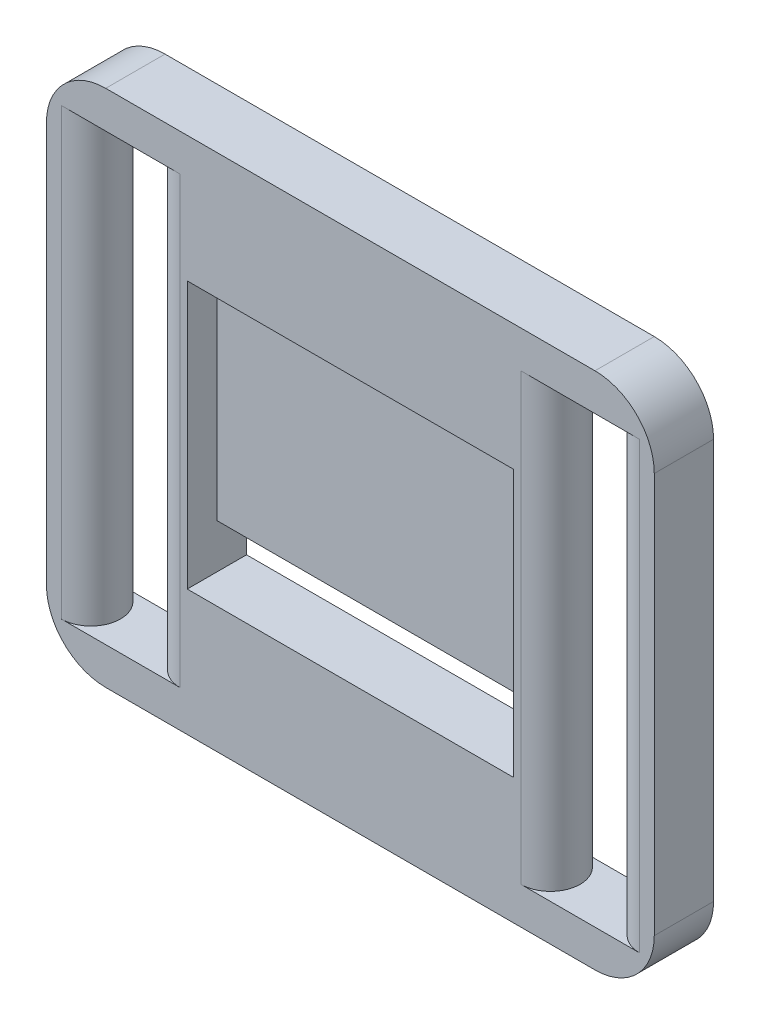
ISO-10303-21;
HEADER;
FILE_DESCRIPTION(('STEP AP214'),'2;1');
FILE_NAME('part.step','',(''),(''),'','','');
FILE_SCHEMA(('AUTOMOTIVE_DESIGN { 1 0 10303 214 1 1 1 1 }'));
ENDSEC;
DATA;
#1=APPLICATION_CONTEXT('core data for automotive mechanical design processes');
#2=APPLICATION_PROTOCOL_DEFINITION('international standard','automotive_design',2000,#1);
#3=PRODUCT_CONTEXT('',#1,'mechanical');
#4=PRODUCT('Part','Part','',(#3));
#5=PRODUCT_RELATED_PRODUCT_CATEGORY('part','',(#4));
#6=PRODUCT_DEFINITION_FORMATION('','',#4);
#7=PRODUCT_DEFINITION_CONTEXT('part definition',#1,'design');
#8=PRODUCT_DEFINITION('design','',#6,#7);
#9=PRODUCT_DEFINITION_SHAPE('','',#8);
#10=(LENGTH_UNIT() NAMED_UNIT(*) SI_UNIT(.MILLI.,.METRE.));
#11=(NAMED_UNIT(*) PLANE_ANGLE_UNIT() SI_UNIT($,.RADIAN.));
#12=(NAMED_UNIT(*) SI_UNIT($,.STERADIAN.) SOLID_ANGLE_UNIT());
#13=UNCERTAINTY_MEASURE_WITH_UNIT(LENGTH_MEASURE(1.E-05),#10,'distance_accuracy_value','');
#14=(GEOMETRIC_REPRESENTATION_CONTEXT(3) GLOBAL_UNCERTAINTY_ASSIGNED_CONTEXT((#13)) GLOBAL_UNIT_ASSIGNED_CONTEXT((#10,
#11,#12)) REPRESENTATION_CONTEXT('',''));
#15=CARTESIAN_POINT('',(0.,0.,0.));
#16=DIRECTION('',(0.,0.,1.));
#17=DIRECTION('',(1.,0.,0.));
#18=AXIS2_PLACEMENT_3D('',#15,#16,#17);
#19=CARTESIAN_POINT('',(9.00000000000002,35.,2.));
#20=DIRECTION('',(0.,1.,0.));
#21=DIRECTION('',(-1.,0.,0.));
#22=AXIS2_PLACEMENT_3D('',#19,#20,#21);
#23=CYLINDRICAL_SURFACE('',#22,2.);
#24=DIRECTION('',(0.,1.,0.));
#25=VECTOR('',#24,1.);
#26=CARTESIAN_POINT('',(9.00000000000002,0.,4.));
#27=LINE('',#26,#25);
#28=CARTESIAN_POINT('',(9.00000000000002,32.5,4.));
#29=VERTEX_POINT('',#28);
#30=CARTESIAN_POINT('',(9.00000000000002,2.50000000000004,4.));
#31=VERTEX_POINT('',#30);
#32=EDGE_CURVE('E347',#29,#31,#27,.F.);
#33=ORIENTED_EDGE('',*,*,#32,.F.);
#34=CARTESIAN_POINT('',(9.00000000000002,32.5,2.));
#35=DIRECTION('',(0.,1.,0.));
#36=DIRECTION('',(0.,0.,1.));
#37=AXIS2_PLACEMENT_3D('',#34,#35,#36);
#38=CIRCLE('',#37,2.);
#39=CARTESIAN_POINT('',(9.00000000000002,32.5,0.));
#40=VERTEX_POINT('',#39);
#41=EDGE_CURVE('E11',#40,#29,#38,.T.);
#42=ORIENTED_EDGE('',*,*,#41,.F.);
#43=DIRECTION('',(0.,-1.,0.));
#44=VECTOR('',#43,1.);
#45=CARTESIAN_POINT('',(9.00000000000002,35.,0.));
#46=LINE('',#45,#44);
#47=CARTESIAN_POINT('',(9.00000000000002,2.50000000000004,0.));
#48=VERTEX_POINT('',#47);
#49=EDGE_CURVE('E350',#48,#40,#46,.F.);
#50=ORIENTED_EDGE('',*,*,#49,.F.);
#51=CARTESIAN_POINT('',(9.00000000000002,2.50000000000004,2.));
#52=DIRECTION('',(0.,-1.,0.));
#53=DIRECTION('',(0.,0.,-1.));
#54=AXIS2_PLACEMENT_3D('',#51,#52,#53);
#55=CIRCLE('',#54,2.);
#56=EDGE_CURVE('E43',#31,#48,#55,.T.);
#57=ORIENTED_EDGE('',*,*,#56,.F.);
#58=EDGE_LOOP('',(#33,#42,#50,#57));
#59=FACE_BOUND('',#58,.T.);
#60=ADVANCED_FACE('F35',(#59),#23,.T.);
#61=CARTESIAN_POINT('',(32.,0.,2.));
#62=DIRECTION('',(0.,-1.,0.));
#63=DIRECTION('',(0.,0.,-1.));
#64=AXIS2_PLACEMENT_3D('',#61,#62,#63);
#65=CYLINDRICAL_SURFACE('',#64,2.);
#66=DIRECTION('',(0.,-1.,0.));
#67=VECTOR('',#66,1.);
#68=CARTESIAN_POINT('',(32.,0.,4.));
#69=LINE('',#68,#67);
#70=CARTESIAN_POINT('',(32.,2.50000000000003,4.));
#71=VERTEX_POINT('',#70);
#72=CARTESIAN_POINT('',(32.,32.5,4.));
#73=VERTEX_POINT('',#72);
#74=EDGE_CURVE('E335',#71,#73,#69,.F.);
#75=ORIENTED_EDGE('',*,*,#74,.F.);
#76=CARTESIAN_POINT('',(32.,2.50000000000003,2.));
#77=DIRECTION('',(0.,-1.,0.));
#78=DIRECTION('',(1.,0.,0.));
#79=AXIS2_PLACEMENT_3D('',#76,#77,#78);
#80=CIRCLE('',#79,2.);
#81=CARTESIAN_POINT('',(32.,2.50000000000003,0.));
#82=VERTEX_POINT('',#81);
#83=EDGE_CURVE('E344',#82,#71,#80,.T.);
#84=ORIENTED_EDGE('',*,*,#83,.F.);
#85=DIRECTION('',(0.,1.,0.));
#86=VECTOR('',#85,1.);
#87=CARTESIAN_POINT('',(32.,0.,0.));
#88=LINE('',#87,#86);
#89=CARTESIAN_POINT('',(32.,32.5,0.));
#90=VERTEX_POINT('',#89);
#91=EDGE_CURVE('E338',#90,#82,#88,.F.);
#92=ORIENTED_EDGE('',*,*,#91,.F.);
#93=CARTESIAN_POINT('',(32.,32.5,2.));
#94=DIRECTION('',(0.,1.,0.));
#95=DIRECTION('',(-1.,0.,0.));
#96=AXIS2_PLACEMENT_3D('',#93,#94,#95);
#97=CIRCLE('',#96,2.);
#98=EDGE_CURVE('E341',#73,#90,#97,.T.);
#99=ORIENTED_EDGE('',*,*,#98,.F.);
#100=EDGE_LOOP('',(#75,#84,#92,#99));
#101=FACE_BOUND('',#100,.T.);
#102=ADVANCED_FACE('F419',(#101),#65,.T.);
#103=CARTESIAN_POINT('',(0.999999992742193,1.35424869716499,2.));
#104=DIRECTION('',(0.,-1.,0.));
#105=DIRECTION('',(1.,0.,0.));
#106=AXIS2_PLACEMENT_3D('',#103,#104,#105);
#107=CYLINDRICAL_SURFACE('',#106,2.00000000241928);
#108=DIRECTION('',(0.,-1.,0.));
#109=VECTOR('',#108,1.);
#110=CARTESIAN_POINT('',(0.999999992742193,0.,4.));
#111=LINE('',#110,#109);
#112=CARTESIAN_POINT('',(0.999999992742193,2.50000000000004,4.00000000241928));
#113=VERTEX_POINT('',#112);
#114=CARTESIAN_POINT('',(0.999999992742189,32.5,4.));
#115=VERTEX_POINT('',#114);
#116=EDGE_CURVE('E325',#113,#115,#111,.F.);
#117=ORIENTED_EDGE('',*,*,#116,.F.);
#118=CARTESIAN_POINT('',(0.999999992742193,2.50000000000004,2.));
#119=DIRECTION('',(0.,-1.,0.));
#120=DIRECTION('',(0.,0.,-1.));
#121=AXIS2_PLACEMENT_3D('',#118,#119,#120);
#122=CIRCLE('',#121,2.00000000241928);
#123=CARTESIAN_POINT('',(0.999999992742193,2.50000000000004,-2.41927701830069E-09));
#124=VERTEX_POINT('',#123);
#125=EDGE_CURVE('E332',#124,#113,#122,.T.);
#126=ORIENTED_EDGE('',*,*,#125,.F.);
#127=DIRECTION('',(0.,1.,0.));
#128=VECTOR('',#127,1.);
#129=CARTESIAN_POINT('',(0.999999992742193,1.35424869716499,0.));
#130=LINE('',#129,#128);
#131=CARTESIAN_POINT('',(0.999999992742189,32.5,0.));
#132=VERTEX_POINT('',#131);
#133=EDGE_CURVE('E328',#132,#124,#130,.F.);
#134=ORIENTED_EDGE('',*,*,#133,.F.);
#135=CARTESIAN_POINT('',(0.999999992742189,32.5,2.));
#136=DIRECTION('',(0.,1.,0.));
#137=DIRECTION('',(0.,0.,1.));
#138=AXIS2_PLACEMENT_3D('',#135,#136,#137);
#139=CIRCLE('',#138,2.00000000241928);
#140=EDGE_CURVE('E330',#115,#132,#139,.T.);
#141=ORIENTED_EDGE('',*,*,#140,.F.);
#142=EDGE_LOOP('',(#117,#126,#134,#141));
#143=FACE_BOUND('',#142,.T.);
#144=ADVANCED_FACE('F364',(#143),#107,.T.);
#145=CARTESIAN_POINT('',(40.0000000072578,33.645751302835,2.));
#146=DIRECTION('',(0.,1.,0.));
#147=DIRECTION('',(0.,0.,1.));
#148=AXIS2_PLACEMENT_3D('',#145,#146,#147);
#149=CYLINDRICAL_SURFACE('',#148,2.00000000241928);
#150=DIRECTION('',(0.,1.,0.));
#151=VECTOR('',#150,1.);
#152=CARTESIAN_POINT('',(40.0000000072578,0.,4.));
#153=LINE('',#152,#151);
#154=CARTESIAN_POINT('',(40.0000000072578,32.5,4.00000000241928));
#155=VERTEX_POINT('',#154);
#156=CARTESIAN_POINT('',(40.0000000072578,2.50000000000003,4.));
#157=VERTEX_POINT('',#156);
#158=EDGE_CURVE('E313',#155,#157,#153,.F.);
#159=ORIENTED_EDGE('',*,*,#158,.F.);
#160=CARTESIAN_POINT('',(40.0000000072578,32.5,2.));
#161=DIRECTION('',(0.,1.,0.));
#162=DIRECTION('',(-1.,0.,0.));
#163=AXIS2_PLACEMENT_3D('',#160,#161,#162);
#164=CIRCLE('',#163,2.00000000241928);
#165=CARTESIAN_POINT('',(40.0000000072578,32.5,-2.41927615093895E-09));
#166=VERTEX_POINT('',#165);
#167=EDGE_CURVE('E322',#166,#155,#164,.T.);
#168=ORIENTED_EDGE('',*,*,#167,.F.);
#169=DIRECTION('',(0.,-1.,0.));
#170=VECTOR('',#169,1.);
#171=CARTESIAN_POINT('',(40.0000000072578,33.645751302835,0.));
#172=LINE('',#171,#170);
#173=CARTESIAN_POINT('',(40.0000000072578,2.50000000000003,0.));
#174=VERTEX_POINT('',#173);
#175=EDGE_CURVE('E316',#174,#166,#172,.F.);
#176=ORIENTED_EDGE('',*,*,#175,.F.);
#177=CARTESIAN_POINT('',(40.0000000072578,2.50000000000003,2.));
#178=DIRECTION('',(0.,-1.,0.));
#179=DIRECTION('',(1.,0.,0.));
#180=AXIS2_PLACEMENT_3D('',#177,#178,#179);
#181=CIRCLE('',#180,2.00000000241928);
#182=EDGE_CURVE('E319',#157,#174,#181,.T.);
#183=ORIENTED_EDGE('',*,*,#182,.F.);
#184=EDGE_LOOP('',(#159,#168,#176,#183));
#185=FACE_BOUND('',#184,.T.);
#186=ADVANCED_FACE('F416',(#185),#149,.T.);
#187=CARTESIAN_POINT('',(0.,0.,4.));
#188=DIRECTION('',(1.,0.,0.));
#189=DIRECTION('',(0.,1.,0.));
#190=AXIS2_PLACEMENT_3D('',#187,#188,#189);
#191=PLANE('',#190);
#192=DIRECTION('',(0.,-1.,0.));
#193=VECTOR('',#192,1.);
#194=CARTESIAN_POINT('',(0.,0.,4.));
#195=LINE('',#194,#193);
#196=CARTESIAN_POINT('',(0.,31.,4.));
#197=VERTEX_POINT('',#196);
#198=CARTESIAN_POINT('',(0.,4.,4.));
#199=VERTEX_POINT('',#198);
#200=EDGE_CURVE('E246',#197,#199,#195,.T.);
#201=ORIENTED_EDGE('',*,*,#200,.F.);
#202=DIRECTION('',(0.,0.,-1.));
#203=VECTOR('',#202,1.);
#204=CARTESIAN_POINT('',(0.,31.,4.));
#205=LINE('',#204,#203);
#206=CARTESIAN_POINT('',(0.,31.,0.));
#207=VERTEX_POINT('',#206);
#208=EDGE_CURVE('E310',#197,#207,#205,.T.);
#209=ORIENTED_EDGE('',*,*,#208,.T.);
#210=DIRECTION('',(0.,-1.,0.));
#211=VECTOR('',#210,1.);
#212=CARTESIAN_POINT('',(0.,0.,0.));
#213=LINE('',#212,#211);
#214=CARTESIAN_POINT('',(0.,4.,0.));
#215=VERTEX_POINT('',#214);
#216=EDGE_CURVE('E241',#207,#215,#213,.T.);
#217=ORIENTED_EDGE('',*,*,#216,.T.);
#218=DIRECTION('',(0.,0.,-1.));
#219=VECTOR('',#218,1.);
#220=CARTESIAN_POINT('',(0.,4.,4.));
#221=LINE('',#220,#219);
#222=EDGE_CURVE('E308',#215,#199,#221,.F.);
#223=ORIENTED_EDGE('',*,*,#222,.T.);
#224=EDGE_LOOP('',(#201,#209,#217,#223));
#225=FACE_BOUND('',#224,.T.);
#226=ADVANCED_FACE('F404',(#225),#191,.F.);
#227=CARTESIAN_POINT('',(0.,0.,4.));
#228=DIRECTION('',(0.,1.,0.));
#229=DIRECTION('',(0.,0.,1.));
#230=AXIS2_PLACEMENT_3D('',#227,#228,#229);
#231=PLANE('',#230);
#232=DIRECTION('',(1.,0.,0.));
#233=VECTOR('',#232,1.);
#234=CARTESIAN_POINT('',(0.,0.,0.));
#235=LINE('',#234,#233);
#236=CARTESIAN_POINT('',(4.,0.,0.));
#237=VERTEX_POINT('',#236);
#238=CARTESIAN_POINT('',(37.,0.,0.));
#239=VERTEX_POINT('',#238);
#240=EDGE_CURVE('E261',#237,#239,#235,.T.);
#241=ORIENTED_EDGE('',*,*,#240,.T.);
#242=DIRECTION('',(0.,0.,-1.));
#243=VECTOR('',#242,1.);
#244=CARTESIAN_POINT('',(37.,0.,4.));
#245=LINE('',#244,#243);
#246=CARTESIAN_POINT('',(37.,0.,4.));
#247=VERTEX_POINT('',#246);
#248=EDGE_CURVE('E293',#239,#247,#245,.F.);
#249=ORIENTED_EDGE('',*,*,#248,.T.);
#250=DIRECTION('',(1.,0.,0.));
#251=VECTOR('',#250,1.);
#252=CARTESIAN_POINT('',(0.,0.,4.));
#253=LINE('',#252,#251);
#254=CARTESIAN_POINT('',(4.,0.,4.));
#255=VERTEX_POINT('',#254);
#256=EDGE_CURVE('E249',#255,#247,#253,.T.);
#257=ORIENTED_EDGE('',*,*,#256,.F.);
#258=DIRECTION('',(0.,0.,-1.));
#259=VECTOR('',#258,1.);
#260=CARTESIAN_POINT('',(4.,0.,4.));
#261=LINE('',#260,#259);
#262=EDGE_CURVE('E290',#255,#237,#261,.T.);
#263=ORIENTED_EDGE('',*,*,#262,.T.);
#264=EDGE_LOOP('',(#241,#249,#257,#263));
#265=FACE_BOUND('',#264,.T.);
#266=ADVANCED_FACE('F408',(#265),#231,.F.);
#267=CARTESIAN_POINT('',(41.,0.,4.));
#268=DIRECTION('',(-1.,0.,0.));
#269=DIRECTION('',(0.,-1.,0.));
#270=AXIS2_PLACEMENT_3D('',#267,#268,#269);
#271=PLANE('',#270);
#272=DIRECTION('',(0.,1.,0.));
#273=VECTOR('',#272,1.);
#274=CARTESIAN_POINT('',(41.,0.,4.));
#275=LINE('',#274,#273);
#276=CARTESIAN_POINT('',(41.,4.,4.));
#277=VERTEX_POINT('',#276);
#278=CARTESIAN_POINT('',(41.,31.,4.));
#279=VERTEX_POINT('',#278);
#280=EDGE_CURVE('E253',#277,#279,#275,.T.);
#281=ORIENTED_EDGE('',*,*,#280,.F.);
#282=DIRECTION('',(0.,0.,-1.));
#283=VECTOR('',#282,1.);
#284=CARTESIAN_POINT('',(41.,4.,4.));
#285=LINE('',#284,#283);
#286=CARTESIAN_POINT('',(41.,4.,0.));
#287=VERTEX_POINT('',#286);
#288=EDGE_CURVE('E279',#277,#287,#285,.T.);
#289=ORIENTED_EDGE('',*,*,#288,.T.);
#290=DIRECTION('',(0.,1.,0.));
#291=VECTOR('',#290,1.);
#292=CARTESIAN_POINT('',(41.,0.,0.));
#293=LINE('',#292,#291);
#294=CARTESIAN_POINT('',(41.,31.,0.));
#295=VERTEX_POINT('',#294);
#296=EDGE_CURVE('E264',#287,#295,#293,.T.);
#297=ORIENTED_EDGE('',*,*,#296,.T.);
#298=DIRECTION('',(0.,0.,-1.));
#299=VECTOR('',#298,1.);
#300=CARTESIAN_POINT('',(41.,31.,4.));
#301=LINE('',#300,#299);
#302=EDGE_CURVE('E277',#295,#279,#301,.F.);
#303=ORIENTED_EDGE('',*,*,#302,.T.);
#304=EDGE_LOOP('',(#281,#289,#297,#303));
#305=FACE_BOUND('',#304,.T.);
#306=ADVANCED_FACE('F386',(#305),#271,.F.);
#307=CARTESIAN_POINT('',(0.,35.,4.));
#308=DIRECTION('',(0.,-1.,0.));
#309=DIRECTION('',(1.,0.,0.));
#310=AXIS2_PLACEMENT_3D('',#307,#308,#309);
#311=PLANE('',#310);
#312=DIRECTION('',(-1.,0.,0.));
#313=VECTOR('',#312,1.);
#314=CARTESIAN_POINT('',(0.,35.,4.));
#315=LINE('',#314,#313);
#316=CARTESIAN_POINT('',(37.,35.,4.));
#317=VERTEX_POINT('',#316);
#318=CARTESIAN_POINT('',(4.00000000000002,35.,4.));
#319=VERTEX_POINT('',#318);
#320=EDGE_CURVE('E256',#317,#319,#315,.T.);
#321=ORIENTED_EDGE('',*,*,#320,.F.);
#322=DIRECTION('',(0.,0.,-1.));
#323=VECTOR('',#322,1.);
#324=CARTESIAN_POINT('',(37.,35.,4.));
#325=LINE('',#324,#323);
#326=CARTESIAN_POINT('',(37.,35.,0.));
#327=VERTEX_POINT('',#326);
#328=EDGE_CURVE('E305',#317,#327,#325,.T.);
#329=ORIENTED_EDGE('',*,*,#328,.T.);
#330=DIRECTION('',(-1.,0.,0.));
#331=VECTOR('',#330,1.);
#332=CARTESIAN_POINT('',(0.,35.,0.));
#333=LINE('',#332,#331);
#334=CARTESIAN_POINT('',(4.00000000000002,35.,0.));
#335=VERTEX_POINT('',#334);
#336=EDGE_CURVE('E250',#327,#335,#333,.T.);
#337=ORIENTED_EDGE('',*,*,#336,.T.);
#338=DIRECTION('',(0.,0.,-1.));
#339=VECTOR('',#338,1.);
#340=CARTESIAN_POINT('',(4.00000000000002,35.,4.));
#341=LINE('',#340,#339);
#342=EDGE_CURVE('E303',#335,#319,#341,.F.);
#343=ORIENTED_EDGE('',*,*,#342,.T.);
#344=EDGE_LOOP('',(#321,#329,#337,#343));
#345=FACE_BOUND('',#344,.T.);
#346=ADVANCED_FACE('F369',(#345),#311,.F.);
#347=CARTESIAN_POINT('',(0.,0.,4.));
#348=DIRECTION('',(0.,0.,-1.));
#349=DIRECTION('',(-1.,0.,0.));
#350=AXIS2_PLACEMENT_3D('',#347,#348,#349);
#351=PLANE('',#350);
#352=DIRECTION('',(1.,0.,0.));
#353=VECTOR('',#352,1.);
#354=CARTESIAN_POINT('',(38.,2.50000000000003,4.));
#355=LINE('',#354,#353);
#356=EDGE_CURVE('E214',#71,#157,#355,.T.);
#357=ORIENTED_EDGE('',*,*,#356,.F.);
#358=ORIENTED_EDGE('',*,*,#74,.T.);
#359=DIRECTION('',(-1.,0.,0.));
#360=VECTOR('',#359,1.);
#361=CARTESIAN_POINT('',(38.,32.5,4.));
#362=LINE('',#361,#360);
#363=EDGE_CURVE('E212',#155,#73,#362,.T.);
#364=ORIENTED_EDGE('',*,*,#363,.F.);
#365=ORIENTED_EDGE('',*,*,#158,.T.);
#366=EDGE_LOOP('',(#357,#358,#364,#365));
#367=FACE_BOUND('',#366,.T.);
#368=DIRECTION('',(-1.,0.,0.));
#369=VECTOR('',#368,1.);
#370=CARTESIAN_POINT('',(3.00000000000002,32.5,4.));
#371=LINE('',#370,#369);
#372=EDGE_CURVE('E222',#29,#115,#371,.T.);
#373=ORIENTED_EDGE('',*,*,#372,.F.);
#374=ORIENTED_EDGE('',*,*,#32,.T.);
#375=DIRECTION('',(1.,0.,0.));
#376=VECTOR('',#375,1.);
#377=CARTESIAN_POINT('',(3.00000000000002,2.50000000000004,4.));
#378=LINE('',#377,#376);
#379=EDGE_CURVE('E220',#113,#31,#378,.T.);
#380=ORIENTED_EDGE('',*,*,#379,.F.);
#381=ORIENTED_EDGE('',*,*,#116,.T.);
#382=EDGE_LOOP('',(#373,#374,#380,#381));
#383=FACE_BOUND('',#382,.T.);
#384=DIRECTION('',(1.,0.,0.));
#385=VECTOR('',#384,1.);
#386=CARTESIAN_POINT('',(9.50000000000002,8.5,4.));
#387=LINE('',#386,#385);
#388=CARTESIAN_POINT('',(9.50000000000002,8.5,4.));
#389=VERTEX_POINT('',#388);
#390=CARTESIAN_POINT('',(31.5,8.5,4.));
#391=VERTEX_POINT('',#390);
#392=EDGE_CURVE('E233',#389,#391,#387,.T.);
#393=ORIENTED_EDGE('',*,*,#392,.F.);
#394=DIRECTION('',(0.,-1.,0.));
#395=VECTOR('',#394,1.);
#396=CARTESIAN_POINT('',(9.50000000000002,26.5,4.));
#397=LINE('',#396,#395);
#398=CARTESIAN_POINT('',(9.50000000000002,26.5,4.));
#399=VERTEX_POINT('',#398);
#400=EDGE_CURVE('E192',#399,#389,#397,.T.);
#401=ORIENTED_EDGE('',*,*,#400,.F.);
#402=DIRECTION('',(-1.,0.,0.));
#403=VECTOR('',#402,1.);
#404=CARTESIAN_POINT('',(9.50000000000002,26.5,4.));
#405=LINE('',#404,#403);
#406=CARTESIAN_POINT('',(31.5,26.5,4.));
#407=VERTEX_POINT('',#406);
#408=EDGE_CURVE('E228',#407,#399,#405,.T.);
#409=ORIENTED_EDGE('',*,*,#408,.F.);
#410=DIRECTION('',(0.,1.,0.));
#411=VECTOR('',#410,1.);
#412=CARTESIAN_POINT('',(31.5,26.5,4.));
#413=LINE('',#412,#411);
#414=EDGE_CURVE('E235',#391,#407,#413,.T.);
#415=ORIENTED_EDGE('',*,*,#414,.F.);
#416=EDGE_LOOP('',(#393,#401,#409,#415));
#417=FACE_BOUND('',#416,.T.);
#418=ORIENTED_EDGE('',*,*,#256,.T.);
#419=CARTESIAN_POINT('',(37.,4.,4.));
#420=DIRECTION('',(0.,0.,-1.));
#421=DIRECTION('',(-1.,0.,0.));
#422=AXIS2_PLACEMENT_3D('',#419,#420,#421);
#423=CIRCLE('',#422,4.);
#424=EDGE_CURVE('E301',#247,#277,#423,.F.);
#425=ORIENTED_EDGE('',*,*,#424,.T.);
#426=ORIENTED_EDGE('',*,*,#280,.T.);
#427=CARTESIAN_POINT('',(37.,31.,4.));
#428=DIRECTION('',(0.,0.,-1.));
#429=DIRECTION('',(-1.,0.,0.));
#430=AXIS2_PLACEMENT_3D('',#427,#428,#429);
#431=CIRCLE('',#430,4.);
#432=EDGE_CURVE('E299',#279,#317,#431,.F.);
#433=ORIENTED_EDGE('',*,*,#432,.T.);
#434=ORIENTED_EDGE('',*,*,#320,.T.);
#435=CARTESIAN_POINT('',(4.00000000000002,31.,4.));
#436=DIRECTION('',(0.,0.,-1.));
#437=DIRECTION('',(-1.,0.,0.));
#438=AXIS2_PLACEMENT_3D('',#435,#436,#437);
#439=CIRCLE('',#438,4.);
#440=EDGE_CURVE('E297',#319,#197,#439,.F.);
#441=ORIENTED_EDGE('',*,*,#440,.T.);
#442=ORIENTED_EDGE('',*,*,#200,.T.);
#443=CARTESIAN_POINT('',(4.,4.,4.));
#444=DIRECTION('',(0.,0.,-1.));
#445=DIRECTION('',(-1.,0.,0.));
#446=AXIS2_PLACEMENT_3D('',#443,#444,#445);
#447=CIRCLE('',#446,4.);
#448=EDGE_CURVE('E295',#199,#255,#447,.F.);
#449=ORIENTED_EDGE('',*,*,#448,.T.);
#450=EDGE_LOOP('',(#418,#425,#426,#433,#434,#441,#442,#449));
#451=FACE_BOUND('',#450,.T.);
#452=ADVANCED_FACE('F366',(#367,#383,#417,#451),#351,.F.);
#453=CARTESIAN_POINT('',(0.,0.,0.));
#454=DIRECTION('',(0.,0.,-1.));
#455=DIRECTION('',(-1.,0.,0.));
#456=AXIS2_PLACEMENT_3D('',#453,#454,#455);
#457=PLANE('',#456);
#458=DIRECTION('',(0.,1.,0.));
#459=VECTOR('',#458,1.);
#460=CARTESIAN_POINT('',(9.50000000000002,0.,0.));
#461=LINE('',#460,#459);
#462=CARTESIAN_POINT('',(9.50000000000002,8.5,0.));
#463=VERTEX_POINT('',#462);
#464=CARTESIAN_POINT('',(9.50000000000002,11.5,0.));
#465=VERTEX_POINT('',#464);
#466=EDGE_CURVE('E189',#463,#465,#461,.T.);
#467=ORIENTED_EDGE('',*,*,#466,.F.);
#468=DIRECTION('',(-1.,0.,0.));
#469=VECTOR('',#468,1.);
#470=CARTESIAN_POINT('',(0.,8.5,0.));
#471=LINE('',#470,#469);
#472=CARTESIAN_POINT('',(31.5,8.5,0.));
#473=VERTEX_POINT('',#472);
#474=EDGE_CURVE('E200',#473,#463,#471,.T.);
#475=ORIENTED_EDGE('',*,*,#474,.F.);
#476=DIRECTION('',(0.,-1.,0.));
#477=VECTOR('',#476,1.);
#478=CARTESIAN_POINT('',(31.5,0.,0.));
#479=LINE('',#478,#477);
#480=CARTESIAN_POINT('',(31.5,11.5,0.));
#481=VERTEX_POINT('',#480);
#482=EDGE_CURVE('E205',#481,#473,#479,.T.);
#483=ORIENTED_EDGE('',*,*,#482,.F.);
#484=DIRECTION('',(1.,0.,0.));
#485=VECTOR('',#484,1.);
#486=CARTESIAN_POINT('',(0.,11.5,0.));
#487=LINE('',#486,#485);
#488=EDGE_CURVE('E211',#465,#481,#487,.T.);
#489=ORIENTED_EDGE('',*,*,#488,.F.);
#490=EDGE_LOOP('',(#467,#475,#483,#489));
#491=FACE_BOUND('',#490,.T.);
#492=ORIENTED_EDGE('',*,*,#91,.T.);
#493=DIRECTION('',(-1.,0.,0.));
#494=VECTOR('',#493,1.);
#495=CARTESIAN_POINT('',(0.,2.50000000000003,0.));
#496=LINE('',#495,#494);
#497=EDGE_CURVE('E273',#174,#82,#496,.T.);
#498=ORIENTED_EDGE('',*,*,#497,.F.);
#499=ORIENTED_EDGE('',*,*,#175,.T.);
#500=DIRECTION('',(1.,0.,0.));
#501=VECTOR('',#500,1.);
#502=CARTESIAN_POINT('',(0.,32.5,0.));
#503=LINE('',#502,#501);
#504=EDGE_CURVE('E271',#90,#166,#503,.T.);
#505=ORIENTED_EDGE('',*,*,#504,.F.);
#506=EDGE_LOOP('',(#492,#498,#499,#505));
#507=FACE_BOUND('',#506,.T.);
#508=ORIENTED_EDGE('',*,*,#49,.T.);
#509=DIRECTION('',(1.,0.,0.));
#510=VECTOR('',#509,1.);
#511=CARTESIAN_POINT('',(0.,32.5,0.));
#512=LINE('',#511,#510);
#513=EDGE_CURVE('E49',#132,#40,#512,.T.);
#514=ORIENTED_EDGE('',*,*,#513,.F.);
#515=ORIENTED_EDGE('',*,*,#133,.T.);
#516=DIRECTION('',(-1.,0.,0.));
#517=VECTOR('',#516,1.);
#518=CARTESIAN_POINT('',(0.,2.50000000000004,0.));
#519=LINE('',#518,#517);
#520=EDGE_CURVE('E57',#48,#124,#519,.T.);
#521=ORIENTED_EDGE('',*,*,#520,.F.);
#522=EDGE_LOOP('',(#508,#514,#515,#521));
#523=FACE_BOUND('',#522,.T.);
#524=ORIENTED_EDGE('',*,*,#296,.F.);
#525=CARTESIAN_POINT('',(37.,4.,0.));
#526=DIRECTION('',(0.,0.,-1.));
#527=DIRECTION('',(-1.,0.,0.));
#528=AXIS2_PLACEMENT_3D('',#525,#526,#527);
#529=CIRCLE('',#528,4.);
#530=EDGE_CURVE('E288',#287,#239,#529,.T.);
#531=ORIENTED_EDGE('',*,*,#530,.T.);
#532=ORIENTED_EDGE('',*,*,#240,.F.);
#533=CARTESIAN_POINT('',(4.,4.,0.));
#534=DIRECTION('',(0.,0.,-1.));
#535=DIRECTION('',(-1.,0.,0.));
#536=AXIS2_PLACEMENT_3D('',#533,#534,#535);
#537=CIRCLE('',#536,4.);
#538=EDGE_CURVE('E282',#237,#215,#537,.T.);
#539=ORIENTED_EDGE('',*,*,#538,.T.);
#540=ORIENTED_EDGE('',*,*,#216,.F.);
#541=CARTESIAN_POINT('',(4.00000000000002,31.,0.));
#542=DIRECTION('',(0.,0.,-1.));
#543=DIRECTION('',(-1.,0.,0.));
#544=AXIS2_PLACEMENT_3D('',#541,#542,#543);
#545=CIRCLE('',#544,4.);
#546=EDGE_CURVE('E284',#207,#335,#545,.T.);
#547=ORIENTED_EDGE('',*,*,#546,.T.);
#548=ORIENTED_EDGE('',*,*,#336,.F.);
#549=CARTESIAN_POINT('',(37.,31.,0.));
#550=DIRECTION('',(0.,0.,-1.));
#551=DIRECTION('',(-1.,0.,0.));
#552=AXIS2_PLACEMENT_3D('',#549,#550,#551);
#553=CIRCLE('',#552,4.);
#554=EDGE_CURVE('E286',#327,#295,#553,.T.);
#555=ORIENTED_EDGE('',*,*,#554,.T.);
#556=EDGE_LOOP('',(#524,#531,#532,#539,#540,#547,#548,#555));
#557=FACE_BOUND('',#556,.T.);
#558=ADVANCED_FACE('F209',(#491,#507,#523,#557),#457,.T.);
#559=CARTESIAN_POINT('',(9.50000000000002,26.5,2.));
#560=DIRECTION('',(-1.,0.,0.));
#561=DIRECTION('',(0.,-1.,0.));
#562=AXIS2_PLACEMENT_3D('',#559,#560,#561);
#563=PLANE('',#562);
#564=ORIENTED_EDGE('',*,*,#400,.T.);
#565=DIRECTION('',(0.,0.,1.));
#566=VECTOR('',#565,1.);
#567=CARTESIAN_POINT('',(9.50000000000002,8.5,2.));
#568=LINE('',#567,#566);
#569=EDGE_CURVE('E184',#463,#389,#568,.T.);
#570=ORIENTED_EDGE('',*,*,#569,.F.);
#571=ORIENTED_EDGE('',*,*,#466,.T.);
#572=DIRECTION('',(0.,0.,1.));
#573=VECTOR('',#572,1.);
#574=CARTESIAN_POINT('',(9.50000000000002,11.5,-2.));
#575=LINE('',#574,#573);
#576=CARTESIAN_POINT('',(9.50000000000002,11.5,2.));
#577=VERTEX_POINT('',#576);
#578=EDGE_CURVE('E206',#465,#577,#575,.T.);
#579=ORIENTED_EDGE('',*,*,#578,.T.);
#580=DIRECTION('',(0.,-1.,0.));
#581=VECTOR('',#580,1.);
#582=CARTESIAN_POINT('',(9.50000000000002,26.5,2.));
#583=LINE('',#582,#581);
#584=CARTESIAN_POINT('',(9.50000000000002,26.5,2.));
#585=VERTEX_POINT('',#584);
#586=EDGE_CURVE('E224',#585,#577,#583,.T.);
#587=ORIENTED_EDGE('',*,*,#586,.F.);
#588=DIRECTION('',(0.,0.,1.));
#589=VECTOR('',#588,1.);
#590=CARTESIAN_POINT('',(9.50000000000002,26.5,2.));
#591=LINE('',#590,#589);
#592=EDGE_CURVE('E239',#585,#399,#591,.T.);
#593=ORIENTED_EDGE('',*,*,#592,.T.);
#594=EDGE_LOOP('',(#564,#570,#571,#579,#587,#593));
#595=FACE_BOUND('',#594,.T.);
#596=ADVANCED_FACE('F186',(#595),#563,.F.);
#597=CARTESIAN_POINT('',(9.50000000000002,26.5,2.));
#598=DIRECTION('',(0.,1.,0.));
#599=DIRECTION('',(0.,0.,1.));
#600=AXIS2_PLACEMENT_3D('',#597,#598,#599);
#601=PLANE('',#600);
#602=ORIENTED_EDGE('',*,*,#408,.T.);
#603=ORIENTED_EDGE('',*,*,#592,.F.);
#604=DIRECTION('',(-1.,0.,0.));
#605=VECTOR('',#604,1.);
#606=CARTESIAN_POINT('',(9.50000000000002,26.5,2.));
#607=LINE('',#606,#605);
#608=CARTESIAN_POINT('',(31.5,26.5,2.));
#609=VERTEX_POINT('',#608);
#610=EDGE_CURVE('E197',#609,#585,#607,.T.);
#611=ORIENTED_EDGE('',*,*,#610,.F.);
#612=DIRECTION('',(0.,0.,1.));
#613=VECTOR('',#612,1.);
#614=CARTESIAN_POINT('',(31.5,26.5,2.));
#615=LINE('',#614,#613);
#616=EDGE_CURVE('E242',#609,#407,#615,.T.);
#617=ORIENTED_EDGE('',*,*,#616,.T.);
#618=EDGE_LOOP('',(#602,#603,#611,#617));
#619=FACE_BOUND('',#618,.T.);
#620=ADVANCED_FACE('F474',(#619),#601,.F.);
#621=CARTESIAN_POINT('',(31.5,26.5,2.));
#622=DIRECTION('',(1.,0.,0.));
#623=DIRECTION('',(0.,0.,-1.));
#624=AXIS2_PLACEMENT_3D('',#621,#622,#623);
#625=PLANE('',#624);
#626=DIRECTION('',(0.,1.,0.));
#627=VECTOR('',#626,1.);
#628=CARTESIAN_POINT('',(31.5,26.5,2.));
#629=LINE('',#628,#627);
#630=CARTESIAN_POINT('',(31.5,11.5,2.));
#631=VERTEX_POINT('',#630);
#632=EDGE_CURVE('E227',#631,#609,#629,.T.);
#633=ORIENTED_EDGE('',*,*,#632,.F.);
#634=DIRECTION('',(0.,0.,1.));
#635=VECTOR('',#634,1.);
#636=CARTESIAN_POINT('',(31.5,11.5,-2.));
#637=LINE('',#636,#635);
#638=EDGE_CURVE('E635',#481,#631,#637,.T.);
#639=ORIENTED_EDGE('',*,*,#638,.F.);
#640=ORIENTED_EDGE('',*,*,#482,.T.);
#641=DIRECTION('',(0.,0.,1.));
#642=VECTOR('',#641,1.);
#643=CARTESIAN_POINT('',(31.5,8.5,2.));
#644=LINE('',#643,#642);
#645=EDGE_CURVE('E196',#473,#391,#644,.T.);
#646=ORIENTED_EDGE('',*,*,#645,.T.);
#647=ORIENTED_EDGE('',*,*,#414,.T.);
#648=ORIENTED_EDGE('',*,*,#616,.F.);
#649=EDGE_LOOP('',(#633,#639,#640,#646,#647,#648));
#650=FACE_BOUND('',#649,.T.);
#651=ADVANCED_FACE('F477',(#650),#625,.F.);
#652=CARTESIAN_POINT('',(9.50000000000002,8.5,2.));
#653=DIRECTION('',(0.,-1.,0.));
#654=DIRECTION('',(0.,0.,-1.));
#655=AXIS2_PLACEMENT_3D('',#652,#653,#654);
#656=PLANE('',#655);
#657=ORIENTED_EDGE('',*,*,#392,.T.);
#658=ORIENTED_EDGE('',*,*,#645,.F.);
#659=ORIENTED_EDGE('',*,*,#474,.T.);
#660=ORIENTED_EDGE('',*,*,#569,.T.);
#661=EDGE_LOOP('',(#657,#658,#659,#660));
#662=FACE_BOUND('',#661,.T.);
#663=ADVANCED_FACE('F201',(#662),#656,.F.);
#664=CARTESIAN_POINT('',(0.,0.,2.));
#665=DIRECTION('',(0.,0.,1.));
#666=DIRECTION('',(1.,0.,0.));
#667=AXIS2_PLACEMENT_3D('',#664,#665,#666);
#668=PLANE('',#667);
#669=DIRECTION('',(-1.,0.,0.));
#670=VECTOR('',#669,1.);
#671=CARTESIAN_POINT('',(0.,11.5,2.));
#672=LINE('',#671,#670);
#673=EDGE_CURVE('E275',#631,#577,#672,.T.);
#674=ORIENTED_EDGE('',*,*,#673,.F.);
#675=ORIENTED_EDGE('',*,*,#632,.T.);
#676=ORIENTED_EDGE('',*,*,#610,.T.);
#677=ORIENTED_EDGE('',*,*,#586,.T.);
#678=EDGE_LOOP('',(#674,#675,#676,#677));
#679=FACE_BOUND('',#678,.T.);
#680=ADVANCED_FACE('F468',(#679),#668,.T.);
#681=CARTESIAN_POINT('',(3.00000000000002,32.5,-2.));
#682=DIRECTION('',(0.,1.,0.));
#683=DIRECTION('',(0.,0.,1.));
#684=AXIS2_PLACEMENT_3D('',#681,#682,#683);
#685=PLANE('',#684);
#686=ORIENTED_EDGE('',*,*,#513,.T.);
#687=ORIENTED_EDGE('',*,*,#41,.T.);
#688=ORIENTED_EDGE('',*,*,#372,.T.);
#689=ORIENTED_EDGE('',*,*,#140,.T.);
#690=EDGE_LOOP('',(#686,#687,#688,#689));
#691=FACE_BOUND('',#690,.T.);
#692=ADVANCED_FACE('F361',(#691),#685,.F.);
#693=CARTESIAN_POINT('',(3.00000000000002,2.50000000000004,-2.));
#694=DIRECTION('',(0.,-1.,0.));
#695=DIRECTION('',(0.,0.,-1.));
#696=AXIS2_PLACEMENT_3D('',#693,#694,#695);
#697=PLANE('',#696);
#698=ORIENTED_EDGE('',*,*,#520,.T.);
#699=ORIENTED_EDGE('',*,*,#125,.T.);
#700=ORIENTED_EDGE('',*,*,#379,.T.);
#701=ORIENTED_EDGE('',*,*,#56,.T.);
#702=EDGE_LOOP('',(#698,#699,#700,#701));
#703=FACE_BOUND('',#702,.T.);
#704=ADVANCED_FACE('F354',(#703),#697,.F.);
#705=CARTESIAN_POINT('',(38.,2.50000000000003,-2.));
#706=DIRECTION('',(0.,-1.,0.));
#707=DIRECTION('',(1.,0.,0.));
#708=AXIS2_PLACEMENT_3D('',#705,#706,#707);
#709=PLANE('',#708);
#710=ORIENTED_EDGE('',*,*,#497,.T.);
#711=ORIENTED_EDGE('',*,*,#83,.T.);
#712=ORIENTED_EDGE('',*,*,#356,.T.);
#713=ORIENTED_EDGE('',*,*,#182,.T.);
#714=EDGE_LOOP('',(#710,#711,#712,#713));
#715=FACE_BOUND('',#714,.T.);
#716=ADVANCED_FACE('F459',(#715),#709,.F.);
#717=CARTESIAN_POINT('',(38.,32.5,-2.));
#718=DIRECTION('',(0.,1.,0.));
#719=DIRECTION('',(-1.,0.,0.));
#720=AXIS2_PLACEMENT_3D('',#717,#718,#719);
#721=PLANE('',#720);
#722=ORIENTED_EDGE('',*,*,#504,.T.);
#723=ORIENTED_EDGE('',*,*,#167,.T.);
#724=ORIENTED_EDGE('',*,*,#363,.T.);
#725=ORIENTED_EDGE('',*,*,#98,.T.);
#726=EDGE_LOOP('',(#722,#723,#724,#725));
#727=FACE_BOUND('',#726,.T.);
#728=ADVANCED_FACE('F453',(#727),#721,.F.);
#729=CARTESIAN_POINT('',(9.50000000000002,11.5,-2.));
#730=DIRECTION('',(0.,1.,0.));
#731=DIRECTION('',(0.,0.,1.));
#732=AXIS2_PLACEMENT_3D('',#729,#730,#731);
#733=PLANE('',#732);
#734=ORIENTED_EDGE('',*,*,#488,.T.);
#735=ORIENTED_EDGE('',*,*,#638,.T.);
#736=ORIENTED_EDGE('',*,*,#673,.T.);
#737=ORIENTED_EDGE('',*,*,#578,.F.);
#738=EDGE_LOOP('',(#734,#735,#736,#737));
#739=FACE_BOUND('',#738,.T.);
#740=ADVANCED_FACE('F449',(#739),#733,.F.);
#741=CARTESIAN_POINT('',(37.,4.,4.));
#742=DIRECTION('',(0.,0.,-1.));
#743=DIRECTION('',(-1.,0.,0.));
#744=AXIS2_PLACEMENT_3D('',#741,#742,#743);
#745=CYLINDRICAL_SURFACE('',#744,4.);
#746=ORIENTED_EDGE('',*,*,#424,.F.);
#747=ORIENTED_EDGE('',*,*,#248,.F.);
#748=ORIENTED_EDGE('',*,*,#530,.F.);
#749=ORIENTED_EDGE('',*,*,#288,.F.);
#750=EDGE_LOOP('',(#746,#747,#748,#749));
#751=FACE_BOUND('',#750,.T.);
#752=ADVANCED_FACE('F383',(#751),#745,.T.);
#753=CARTESIAN_POINT('',(37.,31.,4.));
#754=DIRECTION('',(0.,0.,-1.));
#755=DIRECTION('',(-1.,0.,0.));
#756=AXIS2_PLACEMENT_3D('',#753,#754,#755);
#757=CYLINDRICAL_SURFACE('',#756,4.);
#758=ORIENTED_EDGE('',*,*,#432,.F.);
#759=ORIENTED_EDGE('',*,*,#302,.F.);
#760=ORIENTED_EDGE('',*,*,#554,.F.);
#761=ORIENTED_EDGE('',*,*,#328,.F.);
#762=EDGE_LOOP('',(#758,#759,#760,#761));
#763=FACE_BOUND('',#762,.T.);
#764=ADVANCED_FACE('F393',(#763),#757,.T.);
#765=CARTESIAN_POINT('',(4.00000000000002,31.,4.));
#766=DIRECTION('',(0.,0.,-1.));
#767=DIRECTION('',(-1.,0.,0.));
#768=AXIS2_PLACEMENT_3D('',#765,#766,#767);
#769=CYLINDRICAL_SURFACE('',#768,4.);
#770=ORIENTED_EDGE('',*,*,#440,.F.);
#771=ORIENTED_EDGE('',*,*,#342,.F.);
#772=ORIENTED_EDGE('',*,*,#546,.F.);
#773=ORIENTED_EDGE('',*,*,#208,.F.);
#774=EDGE_LOOP('',(#770,#771,#772,#773));
#775=FACE_BOUND('',#774,.T.);
#776=ADVANCED_FACE('F401',(#775),#769,.T.);
#777=CARTESIAN_POINT('',(4.,4.,4.));
#778=DIRECTION('',(0.,0.,-1.));
#779=DIRECTION('',(-1.,0.,0.));
#780=AXIS2_PLACEMENT_3D('',#777,#778,#779);
#781=CYLINDRICAL_SURFACE('',#780,4.);
#782=ORIENTED_EDGE('',*,*,#448,.F.);
#783=ORIENTED_EDGE('',*,*,#222,.F.);
#784=ORIENTED_EDGE('',*,*,#538,.F.);
#785=ORIENTED_EDGE('',*,*,#262,.F.);
#786=EDGE_LOOP('',(#782,#783,#784,#785));
#787=FACE_BOUND('',#786,.T.);
#788=ADVANCED_FACE('F407',(#787),#781,.T.);
#789=CLOSED_SHELL('',(#60,#102,#144,#186,#226,#266,#306,#346,#452,#558,#596,#620,#651,#663,#680,
#692,#704,#716,#728,#740,#752,#764,#776,#788));
#790=MANIFOLD_SOLID_BREP('B2',#789);
#791=ADVANCED_BREP_SHAPE_REPRESENTATION('',(#18,#790),#14);
#792=SHAPE_DEFINITION_REPRESENTATION(#9,#791);
ENDSEC;
END-ISO-10303-21;
